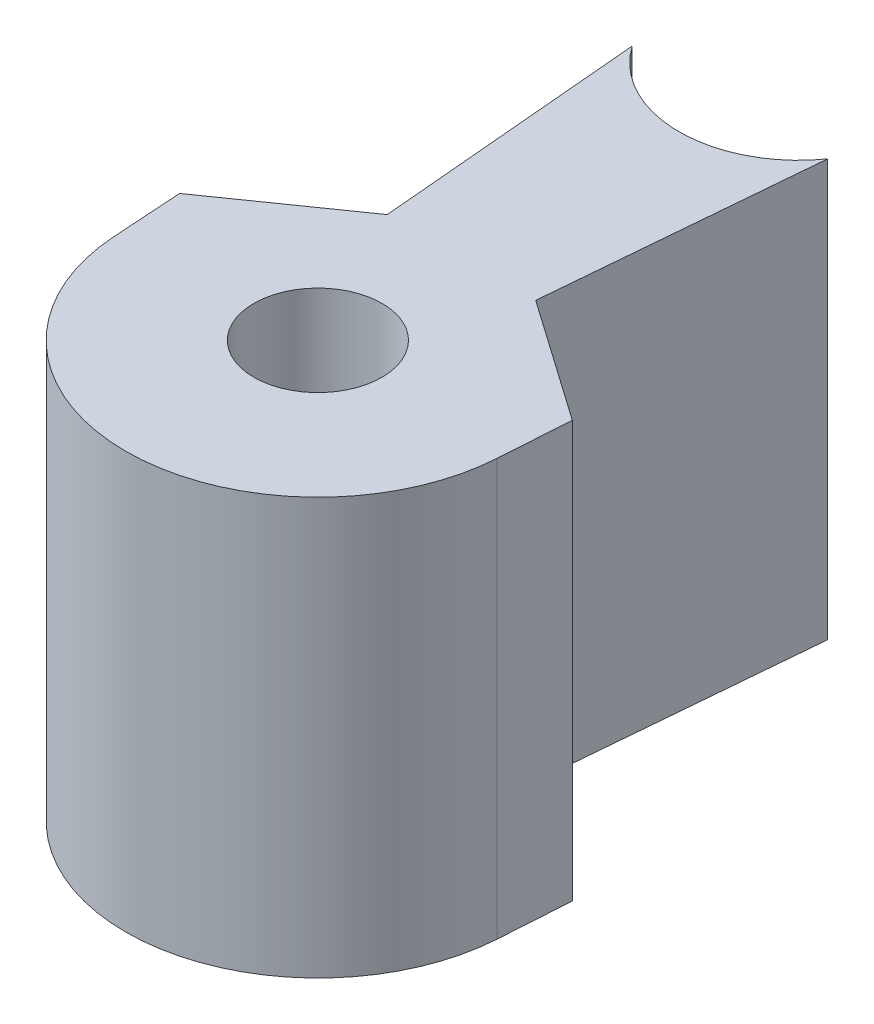
ISO-10303-21;
HEADER;
FILE_DESCRIPTION(('STEP AP214'),'2;1');
FILE_NAME('part.step','',(''),(''),'','','');
FILE_SCHEMA(('AUTOMOTIVE_DESIGN { 1 0 10303 214 1 1 1 1 }'));
ENDSEC;
DATA;
#1=APPLICATION_CONTEXT('core data for automotive mechanical design processes');
#2=APPLICATION_PROTOCOL_DEFINITION('international standard','automotive_design',2000,#1);
#3=PRODUCT_CONTEXT('',#1,'mechanical');
#4=PRODUCT('Part','Part','',(#3));
#5=PRODUCT_RELATED_PRODUCT_CATEGORY('part','',(#4));
#6=PRODUCT_DEFINITION_FORMATION('','',#4);
#7=PRODUCT_DEFINITION_CONTEXT('part definition',#1,'design');
#8=PRODUCT_DEFINITION('design','',#6,#7);
#9=PRODUCT_DEFINITION_SHAPE('','',#8);
#10=(LENGTH_UNIT() NAMED_UNIT(*) SI_UNIT(.MILLI.,.METRE.));
#11=(NAMED_UNIT(*) PLANE_ANGLE_UNIT() SI_UNIT($,.RADIAN.));
#12=(NAMED_UNIT(*) SI_UNIT($,.STERADIAN.) SOLID_ANGLE_UNIT());
#13=UNCERTAINTY_MEASURE_WITH_UNIT(LENGTH_MEASURE(1.E-05),#10,'distance_accuracy_value','');
#14=(GEOMETRIC_REPRESENTATION_CONTEXT(3) GLOBAL_UNCERTAINTY_ASSIGNED_CONTEXT((#13)) GLOBAL_UNIT_ASSIGNED_CONTEXT((#10,
#11,#12)) REPRESENTATION_CONTEXT('',''));
#15=CARTESIAN_POINT('',(0.,0.,0.));
#16=DIRECTION('',(0.,0.,1.));
#17=DIRECTION('',(1.,0.,0.));
#18=AXIS2_PLACEMENT_3D('',#15,#16,#17);
#19=CARTESIAN_POINT('',(0.,1.75,0.));
#20=DIRECTION('',(-0.573576436351044,0.,0.819152044288993));
#21=DIRECTION('',(0.819152044288993,0.,0.573576436351044));
#22=AXIS2_PLACEMENT_3D('',#19,#20,#21);
#23=PLANE('',#22);
#24=DIRECTION('',(0.,-1.,0.));
#25=VECTOR('',#24,1.);
#26=CARTESIAN_POINT('',(0.6102682729953,1.75,0.427314445081528));
#27=LINE('',#26,#25);
#28=CARTESIAN_POINT('',(0.6102682729953,1.75,0.427314445081528));
#29=VERTEX_POINT('',#28);
#30=CARTESIAN_POINT('',(0.6102682729953,0.85,0.427314445081528));
#31=VERTEX_POINT('',#30);
#32=EDGE_CURVE('E40',#29,#31,#27,.T.);
#33=ORIENTED_EDGE('',*,*,#32,.T.);
#34=DIRECTION('',(-0.819152044288993,0.,-0.573576436351044));
#35=VECTOR('',#34,1.);
#36=CARTESIAN_POINT('',(0.,0.85,0.));
#37=LINE('',#36,#35);
#38=CARTESIAN_POINT('',(0.479203945909061,0.85,0.335542215265361));
#39=VERTEX_POINT('',#38);
#40=EDGE_CURVE('E150',#31,#39,#37,.T.);
#41=ORIENTED_EDGE('',*,*,#40,.T.);
#42=DIRECTION('',(0.,-1.,0.));
#43=VECTOR('',#42,1.);
#44=CARTESIAN_POINT('',(0.479203945909061,1.75,0.335542215265361));
#45=LINE('',#44,#43);
#46=CARTESIAN_POINT('',(0.479203945909061,1.75,0.335542215265361));
#47=VERTEX_POINT('',#46);
#48=EDGE_CURVE('E11',#47,#39,#45,.T.);
#49=ORIENTED_EDGE('',*,*,#48,.F.);
#50=DIRECTION('',(-0.819152044288993,0.,-0.573576436351044));
#51=VECTOR('',#50,1.);
#52=CARTESIAN_POINT('',(0.,1.75,0.));
#53=LINE('',#52,#51);
#54=EDGE_CURVE('E166',#29,#47,#53,.T.);
#55=ORIENTED_EDGE('',*,*,#54,.F.);
#56=EDGE_LOOP('',(#33,#41,#49,#55));
#57=FACE_BOUND('',#56,.T.);
#58=ADVANCED_FACE('F37',(#57),#23,.F.);
#59=CARTESIAN_POINT('',(0.,1.75,0.));
#60=DIRECTION('',(0.,-1.,0.));
#61=DIRECTION('',(0.,0.,-1.));
#62=AXIS2_PLACEMENT_3D('',#59,#60,#61);
#63=CYLINDRICAL_SURFACE('',#62,0.585);
#64=ORIENTED_EDGE('',*,*,#48,.T.);
#65=CARTESIAN_POINT('',(0.,0.85,0.));
#66=DIRECTION('',(0.,-1.,0.));
#67=DIRECTION('',(0.,0.,-1.));
#68=AXIS2_PLACEMENT_3D('',#65,#66,#67);
#69=CIRCLE('',#68,0.585);
#70=CARTESIAN_POINT('',(-0.479203945909061,0.85,0.335542215265361));
#71=VERTEX_POINT('',#70);
#72=EDGE_CURVE('E163',#39,#71,#69,.T.);
#73=ORIENTED_EDGE('',*,*,#72,.T.);
#74=DIRECTION('',(0.,-1.,0.));
#75=VECTOR('',#74,1.);
#76=CARTESIAN_POINT('',(-0.479203945909061,1.75,0.335542215265361));
#77=LINE('',#76,#75);
#78=CARTESIAN_POINT('',(-0.479203945909061,1.75,0.335542215265361));
#79=VERTEX_POINT('',#78);
#80=EDGE_CURVE('E45',#79,#71,#77,.T.);
#81=ORIENTED_EDGE('',*,*,#80,.F.);
#82=CARTESIAN_POINT('',(0.,1.75,0.));
#83=DIRECTION('',(0.,-1.,0.));
#84=DIRECTION('',(0.,0.,-1.));
#85=AXIS2_PLACEMENT_3D('',#82,#83,#84);
#86=CIRCLE('',#85,0.585);
#87=EDGE_CURVE('E52',#47,#79,#86,.T.);
#88=ORIENTED_EDGE('',*,*,#87,.F.);
#89=EDGE_LOOP('',(#64,#73,#81,#88));
#90=FACE_BOUND('',#89,.T.);
#91=ADVANCED_FACE('F272',(#90),#63,.F.);
#92=CARTESIAN_POINT('',(0.,1.75,0.));
#93=DIRECTION('',(0.573576436351044,0.,0.819152044288993));
#94=DIRECTION('',(0.819152044288993,0.,-0.573576436351044));
#95=AXIS2_PLACEMENT_3D('',#92,#93,#94);
#96=PLANE('',#95);
#97=ORIENTED_EDGE('',*,*,#80,.T.);
#98=DIRECTION('',(-0.819152044288993,0.,0.573576436351044));
#99=VECTOR('',#98,1.);
#100=CARTESIAN_POINT('',(0.,0.85,0.));
#101=LINE('',#100,#99);
#102=CARTESIAN_POINT('',(-0.6102682729953,0.85,0.427314445081528));
#103=VERTEX_POINT('',#102);
#104=EDGE_CURVE('E160',#71,#103,#101,.T.);
#105=ORIENTED_EDGE('',*,*,#104,.T.);
#106=DIRECTION('',(0.,-1.,0.));
#107=VECTOR('',#106,1.);
#108=CARTESIAN_POINT('',(-0.6102682729953,1.75,0.427314445081528));
#109=LINE('',#108,#107);
#110=CARTESIAN_POINT('',(-0.6102682729953,1.75,0.427314445081528));
#111=VERTEX_POINT('',#110);
#112=EDGE_CURVE('E174',#111,#103,#109,.T.);
#113=ORIENTED_EDGE('',*,*,#112,.F.);
#114=DIRECTION('',(-0.819152044288993,0.,0.573576436351044));
#115=VECTOR('',#114,1.);
#116=CARTESIAN_POINT('',(0.,1.75,0.));
#117=LINE('',#116,#115);
#118=EDGE_CURVE('E171',#79,#111,#117,.T.);
#119=ORIENTED_EDGE('',*,*,#118,.F.);
#120=EDGE_LOOP('',(#97,#105,#113,#119));
#121=FACE_BOUND('',#120,.T.);
#122=ADVANCED_FACE('F276',(#121),#96,.F.);
#123=CARTESIAN_POINT('',(0.,1.75,0.));
#124=DIRECTION('',(0.,-1.,0.));
#125=DIRECTION('',(0.,0.,-1.));
#126=AXIS2_PLACEMENT_3D('',#123,#124,#125);
#127=PLANE('',#126);
#128=ORIENTED_EDGE('',*,*,#54,.T.);
#129=ORIENTED_EDGE('',*,*,#87,.T.);
#130=ORIENTED_EDGE('',*,*,#118,.T.);
#131=CARTESIAN_POINT('',(0.,1.75,0.));
#132=DIRECTION('',(0.,-1.,0.));
#133=DIRECTION('',(0.,0.,-1.));
#134=AXIS2_PLACEMENT_3D('',#131,#132,#133);
#135=CIRCLE('',#134,0.745);
#136=EDGE_CURVE('E168',#29,#111,#135,.T.);
#137=ORIENTED_EDGE('',*,*,#136,.F.);
#138=EDGE_LOOP('',(#128,#129,#130,#137));
#139=FACE_BOUND('',#138,.T.);
#140=ADVANCED_FACE('F281',(#139),#127,.F.);
#141=CARTESIAN_POINT('',(0.,0.85,0.));
#142=DIRECTION('',(0.,-1.,0.));
#143=DIRECTION('',(0.,0.,-1.));
#144=AXIS2_PLACEMENT_3D('',#141,#142,#143);
#145=PLANE('',#144);
#146=ORIENTED_EDGE('',*,*,#40,.F.);
#147=CARTESIAN_POINT('',(0.,0.85,0.));
#148=DIRECTION('',(0.,-1.,0.));
#149=DIRECTION('',(0.,0.,-1.));
#150=AXIS2_PLACEMENT_3D('',#147,#148,#149);
#151=CIRCLE('',#150,0.745);
#152=EDGE_CURVE('E153',#31,#103,#151,.T.);
#153=ORIENTED_EDGE('',*,*,#152,.T.);
#154=ORIENTED_EDGE('',*,*,#104,.F.);
#155=ORIENTED_EDGE('',*,*,#72,.F.);
#156=EDGE_LOOP('',(#146,#153,#154,#155));
#157=FACE_BOUND('',#156,.T.);
#158=ADVANCED_FACE('F189',(#157),#145,.T.);
#159=CARTESIAN_POINT('',(0.,2.6,0.));
#160=DIRECTION('',(0.,-1.,0.));
#161=DIRECTION('',(0.,0.,-1.));
#162=AXIS2_PLACEMENT_3D('',#159,#160,#161);
#163=CYLINDRICAL_SURFACE('',#162,0.745);
#164=ORIENTED_EDGE('',*,*,#152,.F.);
#165=DIRECTION('',(0.,-1.,0.));
#166=VECTOR('',#165,1.);
#167=CARTESIAN_POINT('',(0.6102682729953,2.6,0.427314445081528));
#168=LINE('',#167,#166);
#169=CARTESIAN_POINT('',(0.6102682729953,0.,0.427314445081528));
#170=VERTEX_POINT('',#169);
#171=EDGE_CURVE('E195',#31,#170,#168,.T.);
#172=ORIENTED_EDGE('',*,*,#171,.T.);
#173=CARTESIAN_POINT('',(0.,0.,0.));
#174=DIRECTION('',(0.,1.,0.));
#175=DIRECTION('',(0.,0.,1.));
#176=AXIS2_PLACEMENT_3D('',#173,#174,#175);
#177=CIRCLE('',#176,0.745);
#178=CARTESIAN_POINT('',(-0.6102682729953,0.,0.427314445081528));
#179=VERTEX_POINT('',#178);
#180=EDGE_CURVE('E227',#179,#170,#177,.T.);
#181=ORIENTED_EDGE('',*,*,#180,.F.);
#182=DIRECTION('',(0.,-1.,0.));
#183=VECTOR('',#182,1.);
#184=CARTESIAN_POINT('',(-0.6102682729953,2.6,0.427314445081528));
#185=LINE('',#184,#183);
#186=EDGE_CURVE('E197',#103,#179,#185,.T.);
#187=ORIENTED_EDGE('',*,*,#186,.F.);
#188=EDGE_LOOP('',(#164,#172,#181,#187));
#189=FACE_BOUND('',#188,.T.);
#190=ADVANCED_FACE('F193',(#189),#163,.F.);
#191=CARTESIAN_POINT('',(-1.39204994320427,2.6,0.0906750000000001));
#192=DIRECTION('',(0.99788526394571,0.,-0.0650000000000001));
#193=DIRECTION('',(-0.0650000000000001,0.,-0.99788526394571));
#194=AXIS2_PLACEMENT_3D('',#191,#192,#193);
#195=PLANE('',#194);
#196=DIRECTION('',(0.065,0.,0.99788526394571));
#197=VECTOR('',#196,1.);
#198=CARTESIAN_POINT('',(-1.39204994320427,0.,0.0906750000000001));
#199=LINE('',#198,#197);
#200=CARTESIAN_POINT('',(-1.22613750826478,0.,2.63777613740721));
#201=VERTEX_POINT('',#200);
#202=CARTESIAN_POINT('',(-1.19746231673485,0.,3.078));
#203=VERTEX_POINT('',#202);
#204=EDGE_CURVE('E149',#201,#203,#199,.T.);
#205=ORIENTED_EDGE('',*,*,#204,.T.);
#206=DIRECTION('',(0.,-1.,0.));
#207=VECTOR('',#206,1.);
#208=CARTESIAN_POINT('',(-1.19746231673485,2.6,3.078));
#209=LINE('',#208,#207);
#210=CARTESIAN_POINT('',(-1.19746231673485,2.6,3.078));
#211=VERTEX_POINT('',#210);
#212=EDGE_CURVE('E129',#211,#203,#209,.T.);
#213=ORIENTED_EDGE('',*,*,#212,.F.);
#214=DIRECTION('',(0.065,0.,0.99788526394571));
#215=VECTOR('',#214,1.);
#216=CARTESIAN_POINT('',(-1.39204994320427,2.6,0.0906750000000001));
#217=LINE('',#216,#215);
#218=CARTESIAN_POINT('',(-1.22613750826478,2.6,2.63777613740721));
#219=VERTEX_POINT('',#218);
#220=EDGE_CURVE('E136',#219,#211,#217,.T.);
#221=ORIENTED_EDGE('',*,*,#220,.F.);
#222=DIRECTION('',(0.,-1.,0.));
#223=VECTOR('',#222,1.);
#224=CARTESIAN_POINT('',(-1.22613750826478,2.6,2.63777613740721));
#225=LINE('',#224,#223);
#226=EDGE_CURVE('E236',#219,#201,#225,.T.);
#227=ORIENTED_EDGE('',*,*,#226,.T.);
#228=EDGE_LOOP('',(#205,#213,#221,#227));
#229=FACE_BOUND('',#228,.T.);
#230=ADVANCED_FACE('F147',(#229),#195,.F.);
#231=CARTESIAN_POINT('',(0.,2.6,3.));
#232=DIRECTION('',(0.,-1.,0.));
#233=DIRECTION('',(0.,0.,-1.));
#234=AXIS2_PLACEMENT_3D('',#231,#232,#233);
#235=CYLINDRICAL_SURFACE('',#234,1.2);
#236=CARTESIAN_POINT('',(0.,0.,3.));
#237=DIRECTION('',(0.,1.,0.));
#238=DIRECTION('',(0.,0.,1.));
#239=AXIS2_PLACEMENT_3D('',#236,#237,#238);
#240=CIRCLE('',#239,1.2);
#241=CARTESIAN_POINT('',(1.19746231673485,0.,3.078));
#242=VERTEX_POINT('',#241);
#243=EDGE_CURVE('E223',#203,#242,#240,.T.);
#244=ORIENTED_EDGE('',*,*,#243,.T.);
#245=DIRECTION('',(0.,-1.,0.));
#246=VECTOR('',#245,1.);
#247=CARTESIAN_POINT('',(1.19746231673485,2.6,3.078));
#248=LINE('',#247,#246);
#249=CARTESIAN_POINT('',(1.19746231673485,2.6,3.078));
#250=VERTEX_POINT('',#249);
#251=EDGE_CURVE('E131',#250,#242,#248,.T.);
#252=ORIENTED_EDGE('',*,*,#251,.F.);
#253=CARTESIAN_POINT('',(0.,2.6,3.));
#254=DIRECTION('',(0.,1.,0.));
#255=DIRECTION('',(0.,0.,1.));
#256=AXIS2_PLACEMENT_3D('',#253,#254,#255);
#257=CIRCLE('',#256,1.2);
#258=EDGE_CURVE('E124',#211,#250,#257,.T.);
#259=ORIENTED_EDGE('',*,*,#258,.F.);
#260=ORIENTED_EDGE('',*,*,#212,.T.);
#261=EDGE_LOOP('',(#244,#252,#259,#260));
#262=FACE_BOUND('',#261,.T.);
#263=ADVANCED_FACE('F127',(#262),#235,.T.);
#264=CARTESIAN_POINT('',(1.39204994320427,2.6,0.0906750000000001));
#265=DIRECTION('',(0.99788526394571,0.,0.0650000000000001));
#266=DIRECTION('',(0.0650000000000001,0.,-0.99788526394571));
#267=AXIS2_PLACEMENT_3D('',#264,#265,#266);
#268=PLANE('',#267);
#269=DIRECTION('',(-0.065,0.,0.99788526394571));
#270=VECTOR('',#269,1.);
#271=CARTESIAN_POINT('',(1.39204994320427,0.,0.0906750000000001));
#272=LINE('',#271,#270);
#273=CARTESIAN_POINT('',(1.22613750826478,0.,2.63777613740721));
#274=VERTEX_POINT('',#273);
#275=EDGE_CURVE('E220',#274,#242,#272,.T.);
#276=ORIENTED_EDGE('',*,*,#275,.F.);
#277=DIRECTION('',(0.,-1.,0.));
#278=VECTOR('',#277,1.);
#279=CARTESIAN_POINT('',(1.22613750826478,2.6,2.63777613740721));
#280=LINE('',#279,#278);
#281=CARTESIAN_POINT('',(1.22613750826478,2.6,2.63777613740721));
#282=VERTEX_POINT('',#281);
#283=EDGE_CURVE('E155',#282,#274,#280,.T.);
#284=ORIENTED_EDGE('',*,*,#283,.F.);
#285=DIRECTION('',(-0.065,0.,0.99788526394571));
#286=VECTOR('',#285,1.);
#287=CARTESIAN_POINT('',(1.39204994320427,2.6,0.0906750000000001));
#288=LINE('',#287,#286);
#289=EDGE_CURVE('E135',#282,#250,#288,.T.);
#290=ORIENTED_EDGE('',*,*,#289,.T.);
#291=ORIENTED_EDGE('',*,*,#251,.T.);
#292=EDGE_LOOP('',(#276,#284,#290,#291));
#293=FACE_BOUND('',#292,.T.);
#294=ADVANCED_FACE('F221',(#293),#268,.T.);
#295=CARTESIAN_POINT('',(-0.835962494827816,2.6,1.19387817069952));
#296=DIRECTION('',(0.573576436351044,0.,-0.819152044288993));
#297=DIRECTION('',(-0.819152044288993,0.,-0.573576436351044));
#298=AXIS2_PLACEMENT_3D('',#295,#296,#297);
#299=PLANE('',#298);
#300=DIRECTION('',(0.819152044288993,0.,0.573576436351044));
#301=VECTOR('',#300,1.);
#302=CARTESIAN_POINT('',(-0.835962494827816,0.,1.19387817069952));
#303=LINE('',#302,#301);
#304=CARTESIAN_POINT('',(0.463591661400463,0.,2.10383578720231));
#305=VERTEX_POINT('',#304);
#306=EDGE_CURVE('E215',#305,#274,#303,.T.);
#307=ORIENTED_EDGE('',*,*,#306,.F.);
#308=DIRECTION('',(0.,-1.,0.));
#309=VECTOR('',#308,1.);
#310=CARTESIAN_POINT('',(0.463591661400463,2.6,2.10383578720231));
#311=LINE('',#310,#309);
#312=CARTESIAN_POINT('',(0.463591661400463,2.6,2.10383578720231));
#313=VERTEX_POINT('',#312);
#314=EDGE_CURVE('E205',#313,#305,#311,.T.);
#315=ORIENTED_EDGE('',*,*,#314,.F.);
#316=DIRECTION('',(0.819152044288993,0.,0.573576436351044));
#317=VECTOR('',#316,1.);
#318=CARTESIAN_POINT('',(-0.835962494827816,2.6,1.19387817069952));
#319=LINE('',#318,#317);
#320=EDGE_CURVE('E217',#313,#282,#319,.T.);
#321=ORIENTED_EDGE('',*,*,#320,.T.);
#322=ORIENTED_EDGE('',*,*,#283,.T.);
#323=EDGE_LOOP('',(#307,#315,#321,#322));
#324=FACE_BOUND('',#323,.T.);
#325=ADVANCED_FACE('F213',(#324),#299,.T.);
#326=CARTESIAN_POINT('',(0.642733787168803,2.6,0.0562319200423545));
#327=DIRECTION('',(0.996194698091746,0.,0.0871557427476585));
#328=DIRECTION('',(0.0871557427476585,0.,-0.996194698091746));
#329=AXIS2_PLACEMENT_3D('',#326,#327,#328);
#330=PLANE('',#329);
#331=DIRECTION('',(-0.0871557427476586,0.,0.996194698091746));
#332=VECTOR('',#331,1.);
#333=CARTESIAN_POINT('',(0.642733787168803,0.,0.0562319200423545));
#334=LINE('',#333,#332);
#335=EDGE_CURVE('E200',#170,#305,#334,.T.);
#336=ORIENTED_EDGE('',*,*,#335,.F.);
#337=ORIENTED_EDGE('',*,*,#171,.F.);
#338=ORIENTED_EDGE('',*,*,#32,.F.);
#339=CARTESIAN_POINT('',(0.6102682729953,2.6,0.427314445081528));
#340=VERTEX_POINT('',#339);
#341=EDGE_CURVE('E202',#340,#29,#168,.T.);
#342=ORIENTED_EDGE('',*,*,#341,.F.);
#343=DIRECTION('',(-0.0871557427476586,0.,0.996194698091746));
#344=VECTOR('',#343,1.);
#345=CARTESIAN_POINT('',(0.642733787168803,2.6,0.0562319200423545));
#346=LINE('',#345,#344);
#347=EDGE_CURVE('E303',#340,#313,#346,.T.);
#348=ORIENTED_EDGE('',*,*,#347,.T.);
#349=ORIENTED_EDGE('',*,*,#314,.T.);
#350=EDGE_LOOP('',(#336,#337,#338,#342,#348,#349));
#351=FACE_BOUND('',#350,.T.);
#352=ADVANCED_FACE('F198',(#351),#330,.T.);
#353=ORIENTED_EDGE('',*,*,#341,.T.);
#354=ORIENTED_EDGE('',*,*,#136,.T.);
#355=CARTESIAN_POINT('',(-0.6102682729953,2.6,0.427314445081528));
#356=VERTEX_POINT('',#355);
#357=EDGE_CURVE('E203',#356,#111,#185,.T.);
#358=ORIENTED_EDGE('',*,*,#357,.F.);
#359=CARTESIAN_POINT('',(0.,2.6,0.));
#360=DIRECTION('',(0.,1.,0.));
#361=DIRECTION('',(0.,0.,1.));
#362=AXIS2_PLACEMENT_3D('',#359,#360,#361);
#363=CIRCLE('',#362,0.745);
#364=EDGE_CURVE('E247',#356,#340,#363,.T.);
#365=ORIENTED_EDGE('',*,*,#364,.T.);
#366=EDGE_LOOP('',(#353,#354,#358,#365));
#367=FACE_BOUND('',#366,.T.);
#368=ADVANCED_FACE('F266',(#367),#163,.F.);
#369=CARTESIAN_POINT('',(-0.642733787168803,2.6,0.0562319200423545));
#370=DIRECTION('',(0.996194698091746,0.,-0.0871557427476585));
#371=DIRECTION('',(-0.0871557427476585,0.,-0.996194698091746));
#372=AXIS2_PLACEMENT_3D('',#369,#370,#371);
#373=PLANE('',#372);
#374=DIRECTION('',(0.0871557427476586,0.,0.996194698091746));
#375=VECTOR('',#374,1.);
#376=CARTESIAN_POINT('',(-0.642733787168803,0.,0.0562319200423545));
#377=LINE('',#376,#375);
#378=CARTESIAN_POINT('',(-0.463591661400463,0.,2.10383578720231));
#379=VERTEX_POINT('',#378);
#380=EDGE_CURVE('E232',#179,#379,#377,.T.);
#381=ORIENTED_EDGE('',*,*,#380,.T.);
#382=DIRECTION('',(0.,-1.,0.));
#383=VECTOR('',#382,1.);
#384=CARTESIAN_POINT('',(-0.463591661400463,2.6,2.10383578720231));
#385=LINE('',#384,#383);
#386=CARTESIAN_POINT('',(-0.463591661400463,2.6,2.10383578720231));
#387=VERTEX_POINT('',#386);
#388=EDGE_CURVE('E237',#387,#379,#385,.T.);
#389=ORIENTED_EDGE('',*,*,#388,.F.);
#390=DIRECTION('',(0.0871557427476586,0.,0.996194698091746));
#391=VECTOR('',#390,1.);
#392=CARTESIAN_POINT('',(-0.642733787168803,2.6,0.0562319200423545));
#393=LINE('',#392,#391);
#394=EDGE_CURVE('E245',#356,#387,#393,.T.);
#395=ORIENTED_EDGE('',*,*,#394,.F.);
#396=ORIENTED_EDGE('',*,*,#357,.T.);
#397=ORIENTED_EDGE('',*,*,#112,.T.);
#398=ORIENTED_EDGE('',*,*,#186,.T.);
#399=EDGE_LOOP('',(#381,#389,#395,#396,#397,#398));
#400=FACE_BOUND('',#399,.T.);
#401=ADVANCED_FACE('F243',(#400),#373,.F.);
#402=CARTESIAN_POINT('',(0.,2.6,3.));
#403=DIRECTION('',(0.,-1.,0.));
#404=DIRECTION('',(0.,0.,-1.));
#405=AXIS2_PLACEMENT_3D('',#402,#403,#404);
#406=CYLINDRICAL_SURFACE('',#405,0.4);
#407=CARTESIAN_POINT('',(0.,2.6,3.));
#408=DIRECTION('',(0.,1.,0.));
#409=DIRECTION('',(0.,0.,1.));
#410=AXIS2_PLACEMENT_3D('',#407,#408,#409);
#411=CIRCLE('',#410,0.4);
#412=CARTESIAN_POINT('',(0.,2.6,3.4));
#413=VERTEX_POINT('',#412);
#414=EDGE_CURVE('E145',#413,#413,#411,.T.);
#415=ORIENTED_EDGE('',*,*,#414,.T.);
#416=EDGE_LOOP('',(#415));
#417=FACE_BOUND('',#416,.T.);
#418=CARTESIAN_POINT('',(0.,0.,3.));
#419=DIRECTION('',(0.,1.,0.));
#420=DIRECTION('',(0.,0.,1.));
#421=AXIS2_PLACEMENT_3D('',#418,#419,#420);
#422=CIRCLE('',#421,0.4);
#423=CARTESIAN_POINT('',(0.,0.,3.4));
#424=VERTEX_POINT('',#423);
#425=EDGE_CURVE('E251',#424,#424,#422,.T.);
#426=ORIENTED_EDGE('',*,*,#425,.F.);
#427=EDGE_LOOP('',(#426));
#428=FACE_BOUND('',#427,.T.);
#429=ADVANCED_FACE('F257',(#417,#428),#406,.F.);
#430=CARTESIAN_POINT('',(0.835962494827816,2.6,1.19387817069952));
#431=DIRECTION('',(0.573576436351044,0.,0.819152044288993));
#432=DIRECTION('',(0.819152044288993,0.,-0.573576436351044));
#433=AXIS2_PLACEMENT_3D('',#430,#431,#432);
#434=PLANE('',#433);
#435=DIRECTION('',(-0.819152044288993,0.,0.573576436351044));
#436=VECTOR('',#435,1.);
#437=CARTESIAN_POINT('',(0.835962494827816,0.,1.19387817069952));
#438=LINE('',#437,#436);
#439=EDGE_CURVE('E234',#379,#201,#438,.T.);
#440=ORIENTED_EDGE('',*,*,#439,.T.);
#441=ORIENTED_EDGE('',*,*,#226,.F.);
#442=DIRECTION('',(-0.819152044288993,0.,0.573576436351044));
#443=VECTOR('',#442,1.);
#444=CARTESIAN_POINT('',(0.835962494827816,2.6,1.19387817069952));
#445=LINE('',#444,#443);
#446=EDGE_CURVE('E141',#387,#219,#445,.T.);
#447=ORIENTED_EDGE('',*,*,#446,.F.);
#448=ORIENTED_EDGE('',*,*,#388,.T.);
#449=EDGE_LOOP('',(#440,#441,#447,#448));
#450=FACE_BOUND('',#449,.T.);
#451=ADVANCED_FACE('F244',(#450),#434,.F.);
#452=CARTESIAN_POINT('',(0.,2.6,0.));
#453=DIRECTION('',(0.,1.,0.));
#454=DIRECTION('',(0.,0.,1.));
#455=AXIS2_PLACEMENT_3D('',#452,#453,#454);
#456=PLANE('',#455);
#457=ORIENTED_EDGE('',*,*,#414,.F.);
#458=EDGE_LOOP('',(#457));
#459=FACE_BOUND('',#458,.T.);
#460=ORIENTED_EDGE('',*,*,#220,.T.);
#461=ORIENTED_EDGE('',*,*,#258,.T.);
#462=ORIENTED_EDGE('',*,*,#289,.F.);
#463=ORIENTED_EDGE('',*,*,#320,.F.);
#464=ORIENTED_EDGE('',*,*,#347,.F.);
#465=ORIENTED_EDGE('',*,*,#364,.F.);
#466=ORIENTED_EDGE('',*,*,#394,.T.);
#467=ORIENTED_EDGE('',*,*,#446,.T.);
#468=EDGE_LOOP('',(#460,#461,#462,#463,#464,#465,#466,#467));
#469=FACE_BOUND('',#468,.T.);
#470=ADVANCED_FACE('F139',(#459,#469),#456,.T.);
#471=CARTESIAN_POINT('',(0.,0.,0.));
#472=DIRECTION('',(0.,1.,0.));
#473=DIRECTION('',(0.,0.,1.));
#474=AXIS2_PLACEMENT_3D('',#471,#472,#473);
#475=PLANE('',#474);
#476=ORIENTED_EDGE('',*,*,#425,.T.);
#477=EDGE_LOOP('',(#476));
#478=FACE_BOUND('',#477,.T.);
#479=ORIENTED_EDGE('',*,*,#204,.F.);
#480=ORIENTED_EDGE('',*,*,#439,.F.);
#481=ORIENTED_EDGE('',*,*,#380,.F.);
#482=ORIENTED_EDGE('',*,*,#180,.T.);
#483=ORIENTED_EDGE('',*,*,#335,.T.);
#484=ORIENTED_EDGE('',*,*,#306,.T.);
#485=ORIENTED_EDGE('',*,*,#275,.T.);
#486=ORIENTED_EDGE('',*,*,#243,.F.);
#487=EDGE_LOOP('',(#479,#480,#481,#482,#483,#484,#485,#486));
#488=FACE_BOUND('',#487,.T.);
#489=ADVANCED_FACE('F225',(#478,#488),#475,.F.);
#490=CLOSED_SHELL('',(#58,#91,#122,#140,#158,#190,#230,#263,#294,#325,#352,#368,#401,#429,#451,
#470,#489));
#491=MANIFOLD_SOLID_BREP('B2',#490);
#492=ADVANCED_BREP_SHAPE_REPRESENTATION('',(#18,#491),#14);
#493=SHAPE_DEFINITION_REPRESENTATION(#9,#492);
ENDSEC;
END-ISO-10303-21;
